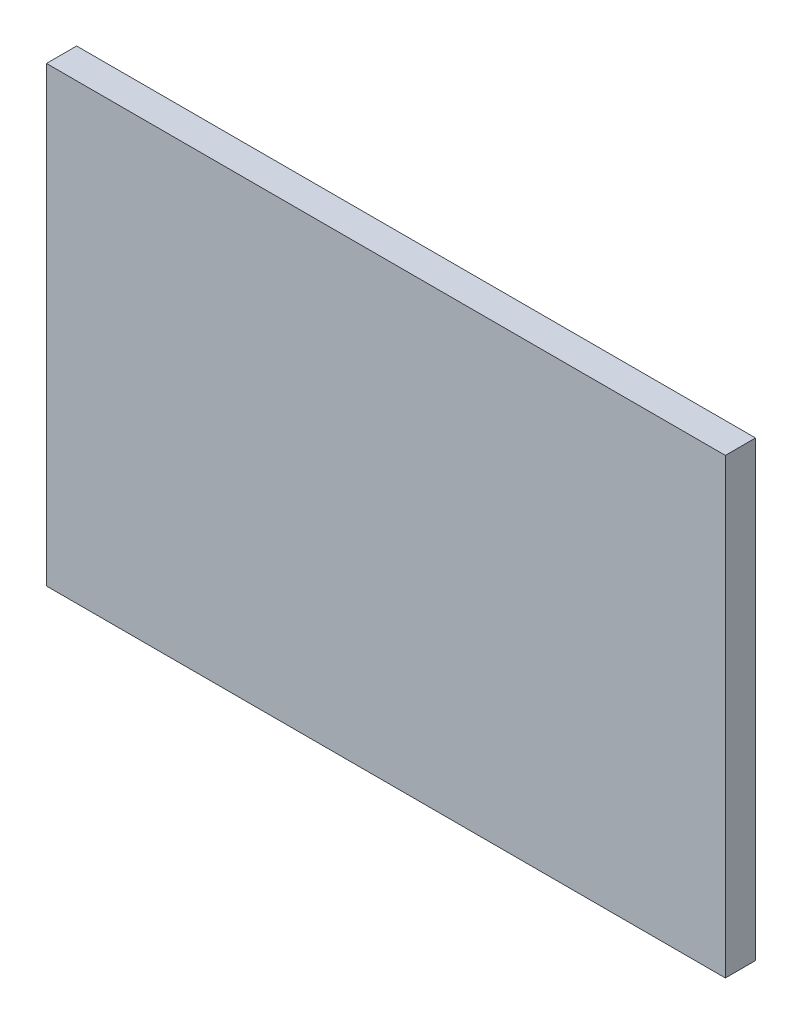
ISO-10303-21;
HEADER;
FILE_DESCRIPTION(('STEP AP214'),'2;1');
FILE_NAME('part.step','',(''),(''),'','','');
FILE_SCHEMA(('AUTOMOTIVE_DESIGN { 1 0 10303 214 1 1 1 1 }'));
ENDSEC;
DATA;
#1=APPLICATION_CONTEXT('core data for automotive mechanical design processes');
#2=APPLICATION_PROTOCOL_DEFINITION('international standard','automotive_design',2000,#1);
#3=PRODUCT_CONTEXT('',#1,'mechanical');
#4=PRODUCT('Part','Part','',(#3));
#5=PRODUCT_RELATED_PRODUCT_CATEGORY('part','',(#4));
#6=PRODUCT_DEFINITION_FORMATION('','',#4);
#7=PRODUCT_DEFINITION_CONTEXT('part definition',#1,'design');
#8=PRODUCT_DEFINITION('design','',#6,#7);
#9=PRODUCT_DEFINITION_SHAPE('','',#8);
#10=(LENGTH_UNIT() NAMED_UNIT(*) SI_UNIT(.MILLI.,.METRE.));
#11=(NAMED_UNIT(*) PLANE_ANGLE_UNIT() SI_UNIT($,.RADIAN.));
#12=(NAMED_UNIT(*) SI_UNIT($,.STERADIAN.) SOLID_ANGLE_UNIT());
#13=UNCERTAINTY_MEASURE_WITH_UNIT(LENGTH_MEASURE(1.E-05),#10,'distance_accuracy_value','');
#14=(GEOMETRIC_REPRESENTATION_CONTEXT(3) GLOBAL_UNCERTAINTY_ASSIGNED_CONTEXT((#13)) GLOBAL_UNIT_ASSIGNED_CONTEXT((#10,
#11,#12)) REPRESENTATION_CONTEXT('',''));
#15=CARTESIAN_POINT('',(0.,0.,0.));
#16=DIRECTION('',(0.,0.,1.));
#17=DIRECTION('',(1.,0.,0.));
#18=AXIS2_PLACEMENT_3D('',#15,#16,#17);
#19=CARTESIAN_POINT('',(22.5,15.,2.));
#20=DIRECTION('',(-1.,0.,0.));
#21=DIRECTION('',(0.,-1.,0.));
#22=AXIS2_PLACEMENT_3D('',#19,#20,#21);
#23=PLANE('',#22);
#24=DIRECTION('',(0.,1.,0.));
#25=VECTOR('',#24,1.);
#26=CARTESIAN_POINT('',(22.5,15.,0.));
#27=LINE('',#26,#25);
#28=CARTESIAN_POINT('',(22.5,-15.,0.));
#29=VERTEX_POINT('',#28);
#30=CARTESIAN_POINT('',(22.5,15.,0.));
#31=VERTEX_POINT('',#30);
#32=EDGE_CURVE('E106',#29,#31,#27,.T.);
#33=ORIENTED_EDGE('',*,*,#32,.T.);
#34=DIRECTION('',(0.,0.,-1.));
#35=VECTOR('',#34,1.);
#36=CARTESIAN_POINT('',(22.5,15.,2.));
#37=LINE('',#36,#35);
#38=CARTESIAN_POINT('',(22.5,15.,2.));
#39=VERTEX_POINT('',#38);
#40=EDGE_CURVE('E11',#39,#31,#37,.T.);
#41=ORIENTED_EDGE('',*,*,#40,.F.);
#42=DIRECTION('',(0.,1.,0.));
#43=VECTOR('',#42,1.);
#44=CARTESIAN_POINT('',(22.5,15.,2.));
#45=LINE('',#44,#43);
#46=CARTESIAN_POINT('',(22.5,-15.,2.));
#47=VERTEX_POINT('',#46);
#48=EDGE_CURVE('E94',#47,#39,#45,.T.);
#49=ORIENTED_EDGE('',*,*,#48,.F.);
#50=DIRECTION('',(0.,0.,-1.));
#51=VECTOR('',#50,1.);
#52=CARTESIAN_POINT('',(22.5,-15.,2.));
#53=LINE('',#52,#51);
#54=EDGE_CURVE('E102',#47,#29,#53,.T.);
#55=ORIENTED_EDGE('',*,*,#54,.T.);
#56=EDGE_LOOP('',(#33,#41,#49,#55));
#57=FACE_BOUND('',#56,.T.);
#58=ADVANCED_FACE('F43',(#57),#23,.F.);
#59=CARTESIAN_POINT('',(-22.5,15.,2.));
#60=DIRECTION('',(0.,-1.,0.));
#61=DIRECTION('',(0.,0.,-1.));
#62=AXIS2_PLACEMENT_3D('',#59,#60,#61);
#63=PLANE('',#62);
#64=DIRECTION('',(-1.,0.,0.));
#65=VECTOR('',#64,1.);
#66=CARTESIAN_POINT('',(-22.5,15.,0.));
#67=LINE('',#66,#65);
#68=CARTESIAN_POINT('',(-22.5,15.,0.));
#69=VERTEX_POINT('',#68);
#70=EDGE_CURVE('E98',#31,#69,#67,.T.);
#71=ORIENTED_EDGE('',*,*,#70,.T.);
#72=DIRECTION('',(0.,0.,-1.));
#73=VECTOR('',#72,1.);
#74=CARTESIAN_POINT('',(-22.5,15.,2.));
#75=LINE('',#74,#73);
#76=CARTESIAN_POINT('',(-22.5,15.,2.));
#77=VERTEX_POINT('',#76);
#78=EDGE_CURVE('E51',#77,#69,#75,.T.);
#79=ORIENTED_EDGE('',*,*,#78,.F.);
#80=DIRECTION('',(-1.,0.,0.));
#81=VECTOR('',#80,1.);
#82=CARTESIAN_POINT('',(-22.5,15.,2.));
#83=LINE('',#82,#81);
#84=EDGE_CURVE('E89',#39,#77,#83,.T.);
#85=ORIENTED_EDGE('',*,*,#84,.F.);
#86=ORIENTED_EDGE('',*,*,#40,.T.);
#87=EDGE_LOOP('',(#71,#79,#85,#86));
#88=FACE_BOUND('',#87,.T.);
#89=ADVANCED_FACE('F97',(#88),#63,.F.);
#90=CARTESIAN_POINT('',(-22.5,15.,2.));
#91=DIRECTION('',(1.,0.,0.));
#92=DIRECTION('',(0.,1.,0.));
#93=AXIS2_PLACEMENT_3D('',#90,#91,#92);
#94=PLANE('',#93);
#95=DIRECTION('',(0.,-1.,0.));
#96=VECTOR('',#95,1.);
#97=CARTESIAN_POINT('',(-22.5,15.,0.));
#98=LINE('',#97,#96);
#99=CARTESIAN_POINT('',(-22.5,-15.,0.));
#100=VERTEX_POINT('',#99);
#101=EDGE_CURVE('E76',#69,#100,#98,.T.);
#102=ORIENTED_EDGE('',*,*,#101,.T.);
#103=DIRECTION('',(0.,0.,-1.));
#104=VECTOR('',#103,1.);
#105=CARTESIAN_POINT('',(-22.5,-15.,2.));
#106=LINE('',#105,#104);
#107=CARTESIAN_POINT('',(-22.5,-15.,2.));
#108=VERTEX_POINT('',#107);
#109=EDGE_CURVE('E99',#108,#100,#106,.T.);
#110=ORIENTED_EDGE('',*,*,#109,.F.);
#111=DIRECTION('',(0.,-1.,0.));
#112=VECTOR('',#111,1.);
#113=CARTESIAN_POINT('',(-22.5,15.,2.));
#114=LINE('',#113,#112);
#115=EDGE_CURVE('E92',#77,#108,#114,.T.);
#116=ORIENTED_EDGE('',*,*,#115,.F.);
#117=ORIENTED_EDGE('',*,*,#78,.T.);
#118=EDGE_LOOP('',(#102,#110,#116,#117));
#119=FACE_BOUND('',#118,.T.);
#120=ADVANCED_FACE('F100',(#119),#94,.F.);
#121=CARTESIAN_POINT('',(-22.5,-15.,2.));
#122=DIRECTION('',(0.,1.,0.));
#123=DIRECTION('',(0.,0.,1.));
#124=AXIS2_PLACEMENT_3D('',#121,#122,#123);
#125=PLANE('',#124);
#126=DIRECTION('',(1.,0.,0.));
#127=VECTOR('',#126,1.);
#128=CARTESIAN_POINT('',(-22.5,-15.,0.));
#129=LINE('',#128,#127);
#130=EDGE_CURVE('E82',#100,#29,#129,.T.);
#131=ORIENTED_EDGE('',*,*,#130,.T.);
#132=ORIENTED_EDGE('',*,*,#54,.F.);
#133=DIRECTION('',(1.,0.,0.));
#134=VECTOR('',#133,1.);
#135=CARTESIAN_POINT('',(-22.5,-15.,2.));
#136=LINE('',#135,#134);
#137=EDGE_CURVE('E59',#108,#47,#136,.T.);
#138=ORIENTED_EDGE('',*,*,#137,.F.);
#139=ORIENTED_EDGE('',*,*,#109,.T.);
#140=EDGE_LOOP('',(#131,#132,#138,#139));
#141=FACE_BOUND('',#140,.T.);
#142=ADVANCED_FACE('F113',(#141),#125,.F.);
#143=CARTESIAN_POINT('',(0.,0.,2.));
#144=DIRECTION('',(0.,0.,1.));
#145=DIRECTION('',(1.,0.,0.));
#146=AXIS2_PLACEMENT_3D('',#143,#144,#145);
#147=PLANE('',#146);
#148=ORIENTED_EDGE('',*,*,#48,.T.);
#149=ORIENTED_EDGE('',*,*,#84,.T.);
#150=ORIENTED_EDGE('',*,*,#115,.T.);
#151=ORIENTED_EDGE('',*,*,#137,.T.);
#152=EDGE_LOOP('',(#148,#149,#150,#151));
#153=FACE_BOUND('',#152,.T.);
#154=ADVANCED_FACE('F90',(#153),#147,.T.);
#155=CARTESIAN_POINT('',(0.,0.,0.));
#156=DIRECTION('',(0.,0.,1.));
#157=DIRECTION('',(1.,0.,0.));
#158=AXIS2_PLACEMENT_3D('',#155,#156,#157);
#159=PLANE('',#158);
#160=ORIENTED_EDGE('',*,*,#32,.F.);
#161=ORIENTED_EDGE('',*,*,#130,.F.);
#162=ORIENTED_EDGE('',*,*,#101,.F.);
#163=ORIENTED_EDGE('',*,*,#70,.F.);
#164=EDGE_LOOP('',(#160,#161,#162,#163));
#165=FACE_BOUND('',#164,.T.);
#166=ADVANCED_FACE('F116',(#165),#159,.F.);
#167=CLOSED_SHELL('',(#58,#89,#120,#142,#154,#166));
#168=MANIFOLD_SOLID_BREP('B2',#167);
#169=ADVANCED_BREP_SHAPE_REPRESENTATION('',(#18,#168),#14);
#170=SHAPE_DEFINITION_REPRESENTATION(#9,#169);
ENDSEC;
END-ISO-10303-21;
